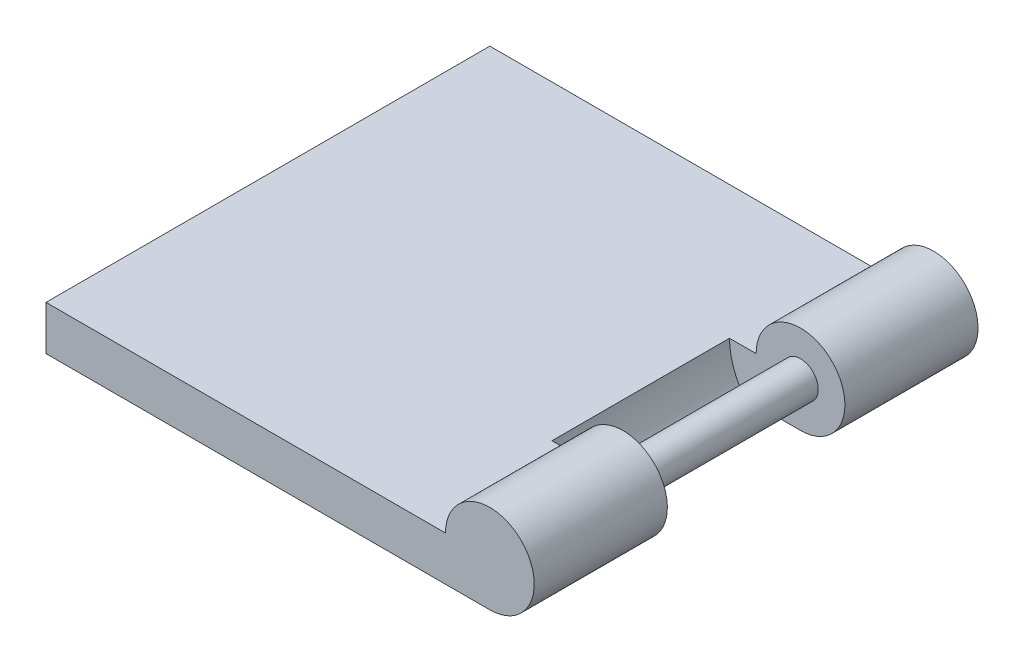
ISO-10303-21;
HEADER;
FILE_DESCRIPTION(('STEP AP214'),'2;1');
FILE_NAME('part.step','',(''),(''),'','','');
FILE_SCHEMA(('AUTOMOTIVE_DESIGN { 1 0 10303 214 1 1 1 1 }'));
ENDSEC;
DATA;
#1=APPLICATION_CONTEXT('core data for automotive mechanical design processes');
#2=APPLICATION_PROTOCOL_DEFINITION('international standard','automotive_design',2000,#1);
#3=PRODUCT_CONTEXT('',#1,'mechanical');
#4=PRODUCT('Part','Part','',(#3));
#5=PRODUCT_RELATED_PRODUCT_CATEGORY('part','',(#4));
#6=PRODUCT_DEFINITION_FORMATION('','',#4);
#7=PRODUCT_DEFINITION_CONTEXT('part definition',#1,'design');
#8=PRODUCT_DEFINITION('design','',#6,#7);
#9=PRODUCT_DEFINITION_SHAPE('','',#8);
#10=(LENGTH_UNIT() NAMED_UNIT(*) SI_UNIT(.MILLI.,.METRE.));
#11=(NAMED_UNIT(*) PLANE_ANGLE_UNIT() SI_UNIT($,.RADIAN.));
#12=(NAMED_UNIT(*) SI_UNIT($,.STERADIAN.) SOLID_ANGLE_UNIT());
#13=UNCERTAINTY_MEASURE_WITH_UNIT(LENGTH_MEASURE(1.E-05),#10,'distance_accuracy_value','');
#14=(GEOMETRIC_REPRESENTATION_CONTEXT(3) GLOBAL_UNCERTAINTY_ASSIGNED_CONTEXT((#13)) GLOBAL_UNIT_ASSIGNED_CONTEXT((#10,
#11,#12)) REPRESENTATION_CONTEXT('',''));
#15=CARTESIAN_POINT('',(0.,0.,0.));
#16=DIRECTION('',(0.,0.,1.));
#17=DIRECTION('',(1.,0.,0.));
#18=AXIS2_PLACEMENT_3D('',#15,#16,#17);
#19=CARTESIAN_POINT('',(0.,0.,-35.));
#20=DIRECTION('',(0.,0.,1.));
#21=DIRECTION('',(1.,0.,0.));
#22=AXIS2_PLACEMENT_3D('',#19,#20,#21);
#23=PLANE('',#22);
#24=CARTESIAN_POINT('',(0.,0.,-35.));
#25=DIRECTION('',(0.,0.,1.));
#26=DIRECTION('',(1.,0.,0.));
#27=AXIS2_PLACEMENT_3D('',#24,#25,#26);
#28=CIRCLE('',#27,2.);
#29=CARTESIAN_POINT('',(2.,0.,-35.));
#30=VERTEX_POINT('',#29);
#31=EDGE_CURVE('E11',#30,#30,#28,.T.);
#32=ORIENTED_EDGE('',*,*,#31,.F.);
#33=EDGE_LOOP('',(#32));
#34=FACE_BOUND('',#33,.T.);
#35=DIRECTION('',(-1.,0.,0.));
#36=VECTOR('',#35,1.);
#37=CARTESIAN_POINT('',(0.,0.,-35.));
#38=LINE('',#37,#36);
#39=CARTESIAN_POINT('',(-5.,0.,-35.));
#40=VERTEX_POINT('',#39);
#41=CARTESIAN_POINT('',(-8.,0.,-35.));
#42=VERTEX_POINT('',#41);
#43=EDGE_CURVE('E54',#40,#42,#38,.T.);
#44=ORIENTED_EDGE('',*,*,#43,.T.);
#45=CARTESIAN_POINT('',(0.,0.,-35.));
#46=DIRECTION('',(0.,0.,1.));
#47=DIRECTION('',(1.,0.,0.));
#48=AXIS2_PLACEMENT_3D('',#45,#46,#47);
#49=CIRCLE('',#48,8.);
#50=CARTESIAN_POINT('',(-6.2449979983984,-5.,-35.));
#51=VERTEX_POINT('',#50);
#52=EDGE_CURVE('E49',#42,#51,#49,.T.);
#53=ORIENTED_EDGE('',*,*,#52,.T.);
#54=DIRECTION('',(1.,0.,0.));
#55=VECTOR('',#54,1.);
#56=CARTESIAN_POINT('',(0.,-5.,-35.));
#57=LINE('',#56,#55);
#58=CARTESIAN_POINT('',(0.,-5.,-35.));
#59=VERTEX_POINT('',#58);
#60=EDGE_CURVE('E152',#51,#59,#57,.T.);
#61=ORIENTED_EDGE('',*,*,#60,.T.);
#62=CARTESIAN_POINT('',(0.,0.,-35.));
#63=DIRECTION('',(0.,0.,1.));
#64=DIRECTION('',(1.,0.,0.));
#65=AXIS2_PLACEMENT_3D('',#62,#63,#64);
#66=CIRCLE('',#65,5.);
#67=EDGE_CURVE('E163',#59,#40,#66,.T.);
#68=ORIENTED_EDGE('',*,*,#67,.T.);
#69=EDGE_LOOP('',(#44,#53,#61,#68));
#70=FACE_BOUND('',#69,.T.);
#71=ADVANCED_FACE('F33',(#34,#70),#23,.T.);
#72=CARTESIAN_POINT('',(0.,0.,-50.));
#73=DIRECTION('',(0.,0.,1.));
#74=DIRECTION('',(1.,0.,0.));
#75=AXIS2_PLACEMENT_3D('',#72,#73,#74);
#76=CYLINDRICAL_SURFACE('',#75,5.);
#77=ORIENTED_EDGE('',*,*,#67,.F.);
#78=DIRECTION('',(0.,0.,1.));
#79=VECTOR('',#78,1.);
#80=CARTESIAN_POINT('',(0.,-5.,-50.));
#81=LINE('',#80,#79);
#82=CARTESIAN_POINT('',(0.,-5.,-50.));
#83=VERTEX_POINT('',#82);
#84=EDGE_CURVE('E154',#83,#59,#81,.T.);
#85=ORIENTED_EDGE('',*,*,#84,.F.);
#86=CARTESIAN_POINT('',(0.,0.,-50.));
#87=DIRECTION('',(0.,0.,1.));
#88=DIRECTION('',(1.,0.,0.));
#89=AXIS2_PLACEMENT_3D('',#86,#87,#88);
#90=CIRCLE('',#89,5.);
#91=CARTESIAN_POINT('',(-5.,0.,-50.));
#92=VERTEX_POINT('',#91);
#93=EDGE_CURVE('E161',#83,#92,#90,.T.);
#94=ORIENTED_EDGE('',*,*,#93,.T.);
#95=DIRECTION('',(0.,0.,1.));
#96=VECTOR('',#95,1.);
#97=CARTESIAN_POINT('',(-5.,0.,-50.));
#98=LINE('',#97,#96);
#99=EDGE_CURVE('E159',#40,#92,#98,.F.);
#100=ORIENTED_EDGE('',*,*,#99,.F.);
#101=EDGE_LOOP('',(#77,#85,#94,#100));
#102=FACE_BOUND('',#101,.T.);
#103=ADVANCED_FACE('F35',(#102),#76,.T.);
#104=CARTESIAN_POINT('',(0.,0.,-50.));
#105=DIRECTION('',(0.,0.,1.));
#106=DIRECTION('',(1.,0.,0.));
#107=AXIS2_PLACEMENT_3D('',#104,#105,#106);
#108=PLANE('',#107);
#109=DIRECTION('',(0.,-1.,0.));
#110=VECTOR('',#109,1.);
#111=CARTESIAN_POINT('',(-50.,0.,-50.));
#112=LINE('',#111,#110);
#113=CARTESIAN_POINT('',(-50.,0.,-50.));
#114=VERTEX_POINT('',#113);
#115=CARTESIAN_POINT('',(-50.,-5.,-50.));
#116=VERTEX_POINT('',#115);
#117=EDGE_CURVE('E131',#114,#116,#112,.T.);
#118=ORIENTED_EDGE('',*,*,#117,.F.);
#119=DIRECTION('',(-1.,0.,0.));
#120=VECTOR('',#119,1.);
#121=CARTESIAN_POINT('',(0.,0.,-50.));
#122=LINE('',#121,#120);
#123=EDGE_CURVE('E149',#92,#114,#122,.T.);
#124=ORIENTED_EDGE('',*,*,#123,.F.);
#125=ORIENTED_EDGE('',*,*,#93,.F.);
#126=DIRECTION('',(1.,0.,0.));
#127=VECTOR('',#126,1.);
#128=CARTESIAN_POINT('',(0.,-5.,-50.));
#129=LINE('',#128,#127);
#130=EDGE_CURVE('E151',#116,#83,#129,.T.);
#131=ORIENTED_EDGE('',*,*,#130,.F.);
#132=EDGE_LOOP('',(#118,#124,#125,#131));
#133=FACE_BOUND('',#132,.T.);
#134=ADVANCED_FACE('F188',(#133),#108,.F.);
#135=CARTESIAN_POINT('',(0.,-5.,-50.));
#136=DIRECTION('',(0.,-1.,0.));
#137=DIRECTION('',(1.,0.,0.));
#138=AXIS2_PLACEMENT_3D('',#135,#136,#137);
#139=PLANE('',#138);
#140=ORIENTED_EDGE('',*,*,#60,.F.);
#141=DIRECTION('',(0.,0.,1.));
#142=VECTOR('',#141,1.);
#143=CARTESIAN_POINT('',(-6.2449979983984,-4.99999999999999,-50.));
#144=LINE('',#143,#142);
#145=CARTESIAN_POINT('',(-6.2449979983984,-4.99999999999999,-15.));
#146=VERTEX_POINT('',#145);
#147=EDGE_CURVE('E103',#51,#146,#144,.T.);
#148=ORIENTED_EDGE('',*,*,#147,.T.);
#149=DIRECTION('',(1.,0.,0.));
#150=VECTOR('',#149,1.);
#151=CARTESIAN_POINT('',(0.,-5.,-15.));
#152=LINE('',#151,#150);
#153=CARTESIAN_POINT('',(0.,-5.,-15.));
#154=VERTEX_POINT('',#153);
#155=EDGE_CURVE('E97',#146,#154,#152,.T.);
#156=ORIENTED_EDGE('',*,*,#155,.T.);
#157=DIRECTION('',(0.,0.,1.));
#158=VECTOR('',#157,1.);
#159=CARTESIAN_POINT('',(0.,-5.,-15.));
#160=LINE('',#159,#158);
#161=CARTESIAN_POINT('',(0.,-5.,0.));
#162=VERTEX_POINT('',#161);
#163=EDGE_CURVE('E100',#154,#162,#160,.T.);
#164=ORIENTED_EDGE('',*,*,#163,.T.);
#165=DIRECTION('',(-1.,0.,0.));
#166=VECTOR('',#165,1.);
#167=CARTESIAN_POINT('',(0.,-4.99999999999999,0.));
#168=LINE('',#167,#166);
#169=CARTESIAN_POINT('',(-50.,-5.,0.));
#170=VERTEX_POINT('',#169);
#171=EDGE_CURVE('E130',#162,#170,#168,.T.);
#172=ORIENTED_EDGE('',*,*,#171,.T.);
#173=DIRECTION('',(0.,0.,1.));
#174=VECTOR('',#173,1.);
#175=CARTESIAN_POINT('',(-50.,-5.,-50.));
#176=LINE('',#175,#174);
#177=EDGE_CURVE('E143',#116,#170,#176,.T.);
#178=ORIENTED_EDGE('',*,*,#177,.F.);
#179=ORIENTED_EDGE('',*,*,#130,.T.);
#180=ORIENTED_EDGE('',*,*,#84,.T.);
#181=EDGE_LOOP('',(#140,#148,#156,#164,#172,#178,#179,#180));
#182=FACE_BOUND('',#181,.T.);
#183=ADVANCED_FACE('F99',(#182),#139,.T.);
#184=CARTESIAN_POINT('',(0.,0.,-50.));
#185=DIRECTION('',(0.,1.,0.));
#186=DIRECTION('',(0.,0.,1.));
#187=AXIS2_PLACEMENT_3D('',#184,#185,#186);
#188=PLANE('',#187);
#189=DIRECTION('',(0.,0.,1.));
#190=VECTOR('',#189,1.);
#191=CARTESIAN_POINT('',(-8.,0.,-50.));
#192=LINE('',#191,#190);
#193=CARTESIAN_POINT('',(-8.,0.,-15.));
#194=VERTEX_POINT('',#193);
#195=EDGE_CURVE('E117',#42,#194,#192,.T.);
#196=ORIENTED_EDGE('',*,*,#195,.F.);
#197=ORIENTED_EDGE('',*,*,#43,.F.);
#198=ORIENTED_EDGE('',*,*,#99,.T.);
#199=ORIENTED_EDGE('',*,*,#123,.T.);
#200=DIRECTION('',(0.,0.,1.));
#201=VECTOR('',#200,1.);
#202=CARTESIAN_POINT('',(-50.,0.,-50.));
#203=LINE('',#202,#201);
#204=CARTESIAN_POINT('',(-50.,0.,0.));
#205=VERTEX_POINT('',#204);
#206=EDGE_CURVE('E134',#114,#205,#203,.T.);
#207=ORIENTED_EDGE('',*,*,#206,.T.);
#208=DIRECTION('',(-1.,0.,0.));
#209=VECTOR('',#208,1.);
#210=CARTESIAN_POINT('',(0.,0.,0.));
#211=LINE('',#210,#209);
#212=CARTESIAN_POINT('',(-5.,0.,0.));
#213=VERTEX_POINT('',#212);
#214=EDGE_CURVE('E135',#213,#205,#211,.T.);
#215=ORIENTED_EDGE('',*,*,#214,.F.);
#216=DIRECTION('',(0.,0.,1.));
#217=VECTOR('',#216,1.);
#218=CARTESIAN_POINT('',(-5.,0.,-50.));
#219=LINE('',#218,#217);
#220=CARTESIAN_POINT('',(-5.,0.,-15.));
#221=VERTEX_POINT('',#220);
#222=EDGE_CURVE('E123',#221,#213,#219,.T.);
#223=ORIENTED_EDGE('',*,*,#222,.F.);
#224=DIRECTION('',(-1.,0.,0.));
#225=VECTOR('',#224,1.);
#226=CARTESIAN_POINT('',(0.,0.,-15.));
#227=LINE('',#226,#225);
#228=EDGE_CURVE('E108',#221,#194,#227,.T.);
#229=ORIENTED_EDGE('',*,*,#228,.T.);
#230=EDGE_LOOP('',(#196,#197,#198,#199,#207,#215,#223,#229));
#231=FACE_BOUND('',#230,.T.);
#232=ADVANCED_FACE('F195',(#231),#188,.T.);
#233=CARTESIAN_POINT('',(-50.,0.,-50.));
#234=DIRECTION('',(-1.,0.,0.));
#235=DIRECTION('',(0.,0.,1.));
#236=AXIS2_PLACEMENT_3D('',#233,#234,#235);
#237=PLANE('',#236);
#238=DIRECTION('',(0.,-1.,0.));
#239=VECTOR('',#238,1.);
#240=CARTESIAN_POINT('',(-50.,0.,0.));
#241=LINE('',#240,#239);
#242=EDGE_CURVE('E137',#205,#170,#241,.T.);
#243=ORIENTED_EDGE('',*,*,#242,.F.);
#244=ORIENTED_EDGE('',*,*,#206,.F.);
#245=ORIENTED_EDGE('',*,*,#117,.T.);
#246=ORIENTED_EDGE('',*,*,#177,.T.);
#247=EDGE_LOOP('',(#243,#244,#245,#246));
#248=FACE_BOUND('',#247,.T.);
#249=ADVANCED_FACE('F198',(#248),#237,.T.);
#250=CARTESIAN_POINT('',(0.,0.,0.));
#251=DIRECTION('',(0.,0.,-1.));
#252=DIRECTION('',(-1.,0.,0.));
#253=AXIS2_PLACEMENT_3D('',#250,#251,#252);
#254=PLANE('',#253);
#255=CARTESIAN_POINT('',(0.,0.,0.));
#256=DIRECTION('',(0.,0.,1.));
#257=DIRECTION('',(1.,0.,0.));
#258=AXIS2_PLACEMENT_3D('',#255,#256,#257);
#259=CIRCLE('',#258,5.);
#260=EDGE_CURVE('E116',#162,#213,#259,.T.);
#261=ORIENTED_EDGE('',*,*,#260,.T.);
#262=ORIENTED_EDGE('',*,*,#214,.T.);
#263=ORIENTED_EDGE('',*,*,#242,.T.);
#264=ORIENTED_EDGE('',*,*,#171,.F.);
#265=EDGE_LOOP('',(#261,#262,#263,#264));
#266=FACE_BOUND('',#265,.T.);
#267=ADVANCED_FACE('F179',(#266),#254,.F.);
#268=CARTESIAN_POINT('',(0.,0.,-50.));
#269=DIRECTION('',(0.,0.,1.));
#270=DIRECTION('',(1.,0.,0.));
#271=AXIS2_PLACEMENT_3D('',#268,#269,#270);
#272=CYLINDRICAL_SURFACE('',#271,8.);
#273=ORIENTED_EDGE('',*,*,#52,.F.);
#274=ORIENTED_EDGE('',*,*,#195,.T.);
#275=CARTESIAN_POINT('',(0.,0.,-15.));
#276=DIRECTION('',(0.,0.,-1.));
#277=DIRECTION('',(-1.,0.,0.));
#278=AXIS2_PLACEMENT_3D('',#275,#276,#277);
#279=CIRCLE('',#278,8.);
#280=EDGE_CURVE('E146',#194,#146,#279,.F.);
#281=ORIENTED_EDGE('',*,*,#280,.T.);
#282=ORIENTED_EDGE('',*,*,#147,.F.);
#283=EDGE_LOOP('',(#273,#274,#281,#282));
#284=FACE_BOUND('',#283,.T.);
#285=ADVANCED_FACE('F171',(#284),#272,.F.);
#286=CARTESIAN_POINT('',(0.,0.,-15.));
#287=DIRECTION('',(0.,0.,-1.));
#288=DIRECTION('',(-1.,0.,0.));
#289=AXIS2_PLACEMENT_3D('',#286,#287,#288);
#290=PLANE('',#289);
#291=CARTESIAN_POINT('',(0.,0.,-15.));
#292=DIRECTION('',(0.,0.,-1.));
#293=DIRECTION('',(-1.,0.,0.));
#294=AXIS2_PLACEMENT_3D('',#291,#292,#293);
#295=CIRCLE('',#294,2.);
#296=CARTESIAN_POINT('',(-2.,0.,-15.));
#297=VERTEX_POINT('',#296);
#298=EDGE_CURVE('E37',#297,#297,#295,.T.);
#299=ORIENTED_EDGE('',*,*,#298,.F.);
#300=EDGE_LOOP('',(#299));
#301=FACE_BOUND('',#300,.T.);
#302=ORIENTED_EDGE('',*,*,#228,.F.);
#303=CARTESIAN_POINT('',(0.,0.,-15.));
#304=DIRECTION('',(0.,0.,1.));
#305=DIRECTION('',(1.,0.,0.));
#306=AXIS2_PLACEMENT_3D('',#303,#304,#305);
#307=CIRCLE('',#306,5.);
#308=EDGE_CURVE('E114',#154,#221,#307,.T.);
#309=ORIENTED_EDGE('',*,*,#308,.F.);
#310=ORIENTED_EDGE('',*,*,#155,.F.);
#311=ORIENTED_EDGE('',*,*,#280,.F.);
#312=EDGE_LOOP('',(#302,#309,#310,#311));
#313=FACE_BOUND('',#312,.T.);
#314=ADVANCED_FACE('F120',(#301,#313),#290,.T.);
#315=CARTESIAN_POINT('',(0.,0.,-50.));
#316=DIRECTION('',(0.,0.,1.));
#317=DIRECTION('',(1.,0.,0.));
#318=AXIS2_PLACEMENT_3D('',#315,#316,#317);
#319=CYLINDRICAL_SURFACE('',#318,5.);
#320=ORIENTED_EDGE('',*,*,#308,.T.);
#321=ORIENTED_EDGE('',*,*,#222,.T.);
#322=ORIENTED_EDGE('',*,*,#260,.F.);
#323=ORIENTED_EDGE('',*,*,#163,.F.);
#324=EDGE_LOOP('',(#320,#321,#322,#323));
#325=FACE_BOUND('',#324,.T.);
#326=ADVANCED_FACE('F112',(#325),#319,.T.);
#327=CARTESIAN_POINT('',(0.,0.,-50.));
#328=DIRECTION('',(0.,0.,1.));
#329=DIRECTION('',(1.,0.,0.));
#330=AXIS2_PLACEMENT_3D('',#327,#328,#329);
#331=CYLINDRICAL_SURFACE('',#330,2.);
#332=ORIENTED_EDGE('',*,*,#31,.T.);
#333=EDGE_LOOP('',(#332));
#334=FACE_BOUND('',#333,.T.);
#335=ORIENTED_EDGE('',*,*,#298,.T.);
#336=EDGE_LOOP('',(#335));
#337=FACE_BOUND('',#336,.T.);
#338=ADVANCED_FACE('F168',(#334,#337),#331,.T.);
#339=CLOSED_SHELL('',(#71,#103,#134,#183,#232,#249,#267,#285,#314,#326,#338));
#340=MANIFOLD_SOLID_BREP('B2',#339);
#341=ADVANCED_BREP_SHAPE_REPRESENTATION('',(#18,#340),#14);
#342=SHAPE_DEFINITION_REPRESENTATION(#9,#341);
ENDSEC;
END-ISO-10303-21;
